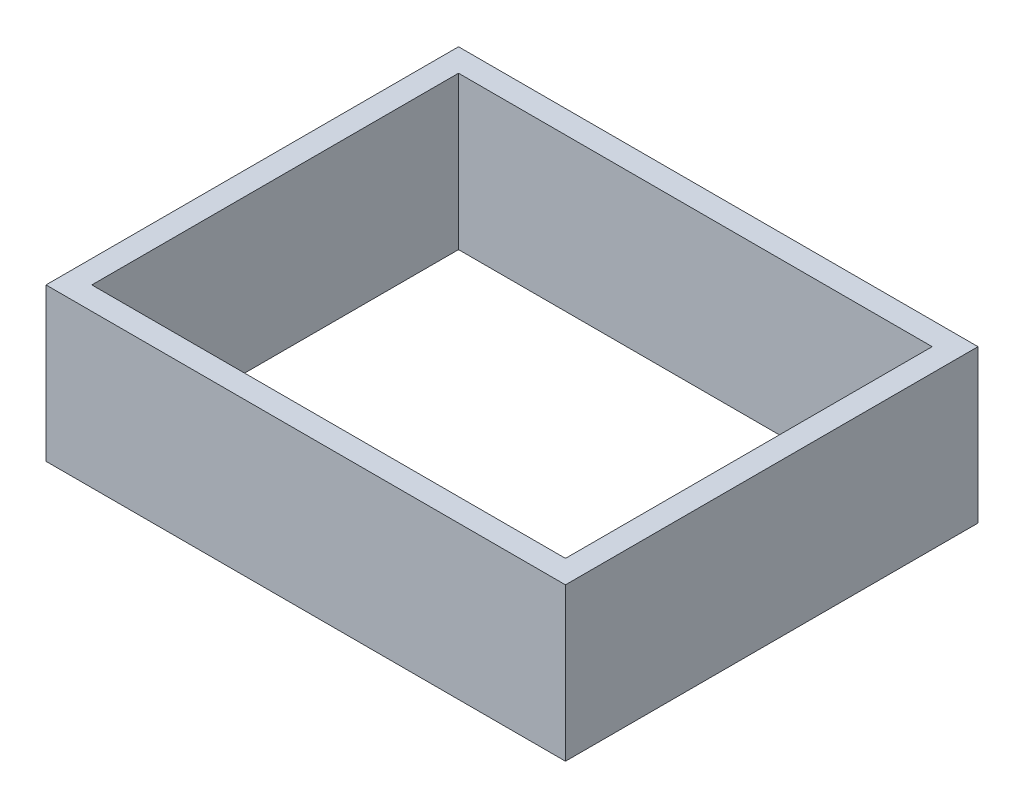
ISO-10303-21;
HEADER;
FILE_DESCRIPTION(('STEP AP214'),'2;1');
FILE_NAME('part.step','',(''),(''),'','','');
FILE_SCHEMA(('AUTOMOTIVE_DESIGN { 1 0 10303 214 1 1 1 1 }'));
ENDSEC;
DATA;
#1=APPLICATION_CONTEXT('core data for automotive mechanical design processes');
#2=APPLICATION_PROTOCOL_DEFINITION('international standard','automotive_design',2000,#1);
#3=PRODUCT_CONTEXT('',#1,'mechanical');
#4=PRODUCT('Part','Part','',(#3));
#5=PRODUCT_RELATED_PRODUCT_CATEGORY('part','',(#4));
#6=PRODUCT_DEFINITION_FORMATION('','',#4);
#7=PRODUCT_DEFINITION_CONTEXT('part definition',#1,'design');
#8=PRODUCT_DEFINITION('design','',#6,#7);
#9=PRODUCT_DEFINITION_SHAPE('','',#8);
#10=(LENGTH_UNIT() NAMED_UNIT(*) SI_UNIT(.MILLI.,.METRE.));
#11=(NAMED_UNIT(*) PLANE_ANGLE_UNIT() SI_UNIT($,.RADIAN.));
#12=(NAMED_UNIT(*) SI_UNIT($,.STERADIAN.) SOLID_ANGLE_UNIT());
#13=UNCERTAINTY_MEASURE_WITH_UNIT(LENGTH_MEASURE(1.E-05),#10,'distance_accuracy_value','');
#14=(GEOMETRIC_REPRESENTATION_CONTEXT(3) GLOBAL_UNCERTAINTY_ASSIGNED_CONTEXT((#13)) GLOBAL_UNIT_ASSIGNED_CONTEXT((#10,
#11,#12)) REPRESENTATION_CONTEXT('',''));
#15=CARTESIAN_POINT('',(0.,0.,0.));
#16=DIRECTION('',(0.,0.,1.));
#17=DIRECTION('',(1.,0.,0.));
#18=AXIS2_PLACEMENT_3D('',#15,#16,#17);
#19=CARTESIAN_POINT('',(0.,20.,0.));
#20=DIRECTION('',(0.,1.,0.));
#21=DIRECTION('',(0.,0.,1.));
#22=AXIS2_PLACEMENT_3D('',#19,#20,#21);
#23=PLANE('',#22);
#24=DIRECTION('',(0.,0.,1.));
#25=VECTOR('',#24,1.);
#26=CARTESIAN_POINT('',(-34.,20.,27.));
#27=LINE('',#26,#25);
#28=CARTESIAN_POINT('',(-34.,20.,-27.));
#29=VERTEX_POINT('',#28);
#30=CARTESIAN_POINT('',(-34.,20.,27.));
#31=VERTEX_POINT('',#30);
#32=EDGE_CURVE('E136',#29,#31,#27,.T.);
#33=ORIENTED_EDGE('',*,*,#32,.T.);
#34=DIRECTION('',(1.,0.,0.));
#35=VECTOR('',#34,1.);
#36=CARTESIAN_POINT('',(34.,20.,27.));
#37=LINE('',#36,#35);
#38=CARTESIAN_POINT('',(34.,20.,27.));
#39=VERTEX_POINT('',#38);
#40=EDGE_CURVE('E139',#31,#39,#37,.T.);
#41=ORIENTED_EDGE('',*,*,#40,.T.);
#42=DIRECTION('',(0.,0.,-1.));
#43=VECTOR('',#42,1.);
#44=CARTESIAN_POINT('',(34.,20.,27.));
#45=LINE('',#44,#43);
#46=CARTESIAN_POINT('',(34.,20.,-27.));
#47=VERTEX_POINT('',#46);
#48=EDGE_CURVE('E142',#39,#47,#45,.T.);
#49=ORIENTED_EDGE('',*,*,#48,.T.);
#50=DIRECTION('',(-1.,0.,0.));
#51=VECTOR('',#50,1.);
#52=CARTESIAN_POINT('',(34.,20.,-27.));
#53=LINE('',#52,#51);
#54=EDGE_CURVE('E144',#47,#29,#53,.T.);
#55=ORIENTED_EDGE('',*,*,#54,.T.);
#56=EDGE_LOOP('',(#33,#41,#49,#55));
#57=FACE_BOUND('',#56,.T.);
#58=DIRECTION('',(-1.,0.,0.));
#59=VECTOR('',#58,1.);
#60=CARTESIAN_POINT('',(31.,20.,-24.));
#61=LINE('',#60,#59);
#62=CARTESIAN_POINT('',(31.,20.,-24.));
#63=VERTEX_POINT('',#62);
#64=CARTESIAN_POINT('',(-31.,20.,-24.));
#65=VERTEX_POINT('',#64);
#66=EDGE_CURVE('E108',#63,#65,#61,.T.);
#67=ORIENTED_EDGE('',*,*,#66,.F.);
#68=DIRECTION('',(0.,0.,-1.));
#69=VECTOR('',#68,1.);
#70=CARTESIAN_POINT('',(31.,20.,24.));
#71=LINE('',#70,#69);
#72=CARTESIAN_POINT('',(31.,20.,24.));
#73=VERTEX_POINT('',#72);
#74=EDGE_CURVE('E100',#73,#63,#71,.T.);
#75=ORIENTED_EDGE('',*,*,#74,.F.);
#76=DIRECTION('',(1.,0.,0.));
#77=VECTOR('',#76,1.);
#78=CARTESIAN_POINT('',(31.,20.,24.));
#79=LINE('',#78,#77);
#80=CARTESIAN_POINT('',(-31.,20.,24.));
#81=VERTEX_POINT('',#80);
#82=EDGE_CURVE('E122',#81,#73,#79,.T.);
#83=ORIENTED_EDGE('',*,*,#82,.F.);
#84=DIRECTION('',(0.,0.,1.));
#85=VECTOR('',#84,1.);
#86=CARTESIAN_POINT('',(-31.,20.,24.));
#87=LINE('',#86,#85);
#88=EDGE_CURVE('E120',#65,#81,#87,.T.);
#89=ORIENTED_EDGE('',*,*,#88,.F.);
#90=EDGE_LOOP('',(#67,#75,#83,#89));
#91=FACE_BOUND('',#90,.T.);
#92=ADVANCED_FACE('F35',(#57,#91),#23,.T.);
#93=CARTESIAN_POINT('',(0.,0.,0.));
#94=DIRECTION('',(0.,1.,0.));
#95=DIRECTION('',(0.,0.,1.));
#96=AXIS2_PLACEMENT_3D('',#93,#94,#95);
#97=PLANE('',#96);
#98=DIRECTION('',(0.,0.,1.));
#99=VECTOR('',#98,1.);
#100=CARTESIAN_POINT('',(-34.,0.,27.));
#101=LINE('',#100,#99);
#102=CARTESIAN_POINT('',(-34.,0.,-27.));
#103=VERTEX_POINT('',#102);
#104=CARTESIAN_POINT('',(-34.,0.,27.));
#105=VERTEX_POINT('',#104);
#106=EDGE_CURVE('E116',#103,#105,#101,.T.);
#107=ORIENTED_EDGE('',*,*,#106,.F.);
#108=DIRECTION('',(-1.,0.,0.));
#109=VECTOR('',#108,1.);
#110=CARTESIAN_POINT('',(34.,0.,-27.));
#111=LINE('',#110,#109);
#112=CARTESIAN_POINT('',(34.,0.,-27.));
#113=VERTEX_POINT('',#112);
#114=EDGE_CURVE('E140',#113,#103,#111,.T.);
#115=ORIENTED_EDGE('',*,*,#114,.F.);
#116=DIRECTION('',(0.,0.,-1.));
#117=VECTOR('',#116,1.);
#118=CARTESIAN_POINT('',(34.,0.,27.));
#119=LINE('',#118,#117);
#120=CARTESIAN_POINT('',(34.,0.,27.));
#121=VERTEX_POINT('',#120);
#122=EDGE_CURVE('E151',#121,#113,#119,.T.);
#123=ORIENTED_EDGE('',*,*,#122,.F.);
#124=DIRECTION('',(1.,0.,0.));
#125=VECTOR('',#124,1.);
#126=CARTESIAN_POINT('',(34.,0.,27.));
#127=LINE('',#126,#125);
#128=EDGE_CURVE('E149',#105,#121,#127,.T.);
#129=ORIENTED_EDGE('',*,*,#128,.F.);
#130=EDGE_LOOP('',(#107,#115,#123,#129));
#131=FACE_BOUND('',#130,.T.);
#132=DIRECTION('',(0.,0.,-1.));
#133=VECTOR('',#132,1.);
#134=CARTESIAN_POINT('',(31.,0.,24.));
#135=LINE('',#134,#133);
#136=CARTESIAN_POINT('',(31.,0.,24.));
#137=VERTEX_POINT('',#136);
#138=CARTESIAN_POINT('',(31.,0.,-24.));
#139=VERTEX_POINT('',#138);
#140=EDGE_CURVE('E58',#137,#139,#135,.T.);
#141=ORIENTED_EDGE('',*,*,#140,.T.);
#142=DIRECTION('',(-1.,0.,0.));
#143=VECTOR('',#142,1.);
#144=CARTESIAN_POINT('',(31.,0.,-24.));
#145=LINE('',#144,#143);
#146=CARTESIAN_POINT('',(-31.,0.,-24.));
#147=VERTEX_POINT('',#146);
#148=EDGE_CURVE('E115',#139,#147,#145,.T.);
#149=ORIENTED_EDGE('',*,*,#148,.T.);
#150=DIRECTION('',(0.,0.,1.));
#151=VECTOR('',#150,1.);
#152=CARTESIAN_POINT('',(-31.,0.,24.));
#153=LINE('',#152,#151);
#154=CARTESIAN_POINT('',(-31.,0.,24.));
#155=VERTEX_POINT('',#154);
#156=EDGE_CURVE('E128',#147,#155,#153,.T.);
#157=ORIENTED_EDGE('',*,*,#156,.T.);
#158=DIRECTION('',(1.,0.,0.));
#159=VECTOR('',#158,1.);
#160=CARTESIAN_POINT('',(31.,0.,24.));
#161=LINE('',#160,#159);
#162=EDGE_CURVE('E109',#155,#137,#161,.T.);
#163=ORIENTED_EDGE('',*,*,#162,.T.);
#164=EDGE_LOOP('',(#141,#149,#157,#163));
#165=FACE_BOUND('',#164,.T.);
#166=ADVANCED_FACE('F169',(#131,#165),#97,.F.);
#167=CARTESIAN_POINT('',(-34.,20.,27.));
#168=DIRECTION('',(1.,0.,0.));
#169=DIRECTION('',(0.,0.,-1.));
#170=AXIS2_PLACEMENT_3D('',#167,#168,#169);
#171=PLANE('',#170);
#172=ORIENTED_EDGE('',*,*,#106,.T.);
#173=DIRECTION('',(0.,-1.,0.));
#174=VECTOR('',#173,1.);
#175=CARTESIAN_POINT('',(-34.,20.,27.));
#176=LINE('',#175,#174);
#177=EDGE_CURVE('E11',#31,#105,#176,.T.);
#178=ORIENTED_EDGE('',*,*,#177,.F.);
#179=ORIENTED_EDGE('',*,*,#32,.F.);
#180=DIRECTION('',(0.,-1.,0.));
#181=VECTOR('',#180,1.);
#182=CARTESIAN_POINT('',(-34.,20.,-27.));
#183=LINE('',#182,#181);
#184=EDGE_CURVE('E146',#29,#103,#183,.T.);
#185=ORIENTED_EDGE('',*,*,#184,.T.);
#186=EDGE_LOOP('',(#172,#178,#179,#185));
#187=FACE_BOUND('',#186,.T.);
#188=ADVANCED_FACE('F37',(#187),#171,.F.);
#189=CARTESIAN_POINT('',(34.,20.,27.));
#190=DIRECTION('',(0.,0.,-1.));
#191=DIRECTION('',(-1.,0.,0.));
#192=AXIS2_PLACEMENT_3D('',#189,#190,#191);
#193=PLANE('',#192);
#194=ORIENTED_EDGE('',*,*,#128,.T.);
#195=DIRECTION('',(0.,-1.,0.));
#196=VECTOR('',#195,1.);
#197=CARTESIAN_POINT('',(34.,20.,27.));
#198=LINE('',#197,#196);
#199=EDGE_CURVE('E43',#39,#121,#198,.T.);
#200=ORIENTED_EDGE('',*,*,#199,.F.);
#201=ORIENTED_EDGE('',*,*,#40,.F.);
#202=ORIENTED_EDGE('',*,*,#177,.T.);
#203=EDGE_LOOP('',(#194,#200,#201,#202));
#204=FACE_BOUND('',#203,.T.);
#205=ADVANCED_FACE('F179',(#204),#193,.F.);
#206=CARTESIAN_POINT('',(34.,20.,27.));
#207=DIRECTION('',(-1.,0.,0.));
#208=DIRECTION('',(0.,0.,1.));
#209=AXIS2_PLACEMENT_3D('',#206,#207,#208);
#210=PLANE('',#209);
#211=ORIENTED_EDGE('',*,*,#122,.T.);
#212=DIRECTION('',(0.,-1.,0.));
#213=VECTOR('',#212,1.);
#214=CARTESIAN_POINT('',(34.,20.,-27.));
#215=LINE('',#214,#213);
#216=EDGE_CURVE('E156',#47,#113,#215,.T.);
#217=ORIENTED_EDGE('',*,*,#216,.F.);
#218=ORIENTED_EDGE('',*,*,#48,.F.);
#219=ORIENTED_EDGE('',*,*,#199,.T.);
#220=EDGE_LOOP('',(#211,#217,#218,#219));
#221=FACE_BOUND('',#220,.T.);
#222=ADVANCED_FACE('F163',(#221),#210,.F.);
#223=CARTESIAN_POINT('',(34.,20.,-27.));
#224=DIRECTION('',(0.,0.,1.));
#225=DIRECTION('',(1.,0.,0.));
#226=AXIS2_PLACEMENT_3D('',#223,#224,#225);
#227=PLANE('',#226);
#228=ORIENTED_EDGE('',*,*,#114,.T.);
#229=ORIENTED_EDGE('',*,*,#184,.F.);
#230=ORIENTED_EDGE('',*,*,#54,.F.);
#231=ORIENTED_EDGE('',*,*,#216,.T.);
#232=EDGE_LOOP('',(#228,#229,#230,#231));
#233=FACE_BOUND('',#232,.T.);
#234=ADVANCED_FACE('F173',(#233),#227,.F.);
#235=CARTESIAN_POINT('',(31.,20.,24.));
#236=DIRECTION('',(-1.,0.,0.));
#237=DIRECTION('',(0.,0.,1.));
#238=AXIS2_PLACEMENT_3D('',#235,#236,#237);
#239=PLANE('',#238);
#240=ORIENTED_EDGE('',*,*,#140,.F.);
#241=DIRECTION('',(0.,-1.,0.));
#242=VECTOR('',#241,1.);
#243=CARTESIAN_POINT('',(31.,20.,24.));
#244=LINE('',#243,#242);
#245=EDGE_CURVE('E104',#73,#137,#244,.T.);
#246=ORIENTED_EDGE('',*,*,#245,.F.);
#247=ORIENTED_EDGE('',*,*,#74,.T.);
#248=DIRECTION('',(0.,-1.,0.));
#249=VECTOR('',#248,1.);
#250=CARTESIAN_POINT('',(31.,20.,-24.));
#251=LINE('',#250,#249);
#252=EDGE_CURVE('E103',#63,#139,#251,.T.);
#253=ORIENTED_EDGE('',*,*,#252,.T.);
#254=EDGE_LOOP('',(#240,#246,#247,#253));
#255=FACE_BOUND('',#254,.T.);
#256=ADVANCED_FACE('F102',(#255),#239,.T.);
#257=CARTESIAN_POINT('',(31.,20.,-24.));
#258=DIRECTION('',(0.,0.,1.));
#259=DIRECTION('',(1.,0.,0.));
#260=AXIS2_PLACEMENT_3D('',#257,#258,#259);
#261=PLANE('',#260);
#262=ORIENTED_EDGE('',*,*,#148,.F.);
#263=ORIENTED_EDGE('',*,*,#252,.F.);
#264=ORIENTED_EDGE('',*,*,#66,.T.);
#265=DIRECTION('',(0.,-1.,0.));
#266=VECTOR('',#265,1.);
#267=CARTESIAN_POINT('',(-31.,20.,-24.));
#268=LINE('',#267,#266);
#269=EDGE_CURVE('E117',#65,#147,#268,.T.);
#270=ORIENTED_EDGE('',*,*,#269,.T.);
#271=EDGE_LOOP('',(#262,#263,#264,#270));
#272=FACE_BOUND('',#271,.T.);
#273=ADVANCED_FACE('F112',(#272),#261,.T.);
#274=CARTESIAN_POINT('',(-31.,20.,24.));
#275=DIRECTION('',(1.,0.,0.));
#276=DIRECTION('',(0.,0.,-1.));
#277=AXIS2_PLACEMENT_3D('',#274,#275,#276);
#278=PLANE('',#277);
#279=ORIENTED_EDGE('',*,*,#156,.F.);
#280=ORIENTED_EDGE('',*,*,#269,.F.);
#281=ORIENTED_EDGE('',*,*,#88,.T.);
#282=DIRECTION('',(0.,-1.,0.));
#283=VECTOR('',#282,1.);
#284=CARTESIAN_POINT('',(-31.,20.,24.));
#285=LINE('',#284,#283);
#286=EDGE_CURVE('E50',#81,#155,#285,.T.);
#287=ORIENTED_EDGE('',*,*,#286,.T.);
#288=EDGE_LOOP('',(#279,#280,#281,#287));
#289=FACE_BOUND('',#288,.T.);
#290=ADVANCED_FACE('F202',(#289),#278,.T.);
#291=CARTESIAN_POINT('',(31.,20.,24.));
#292=DIRECTION('',(0.,0.,-1.));
#293=DIRECTION('',(-1.,0.,0.));
#294=AXIS2_PLACEMENT_3D('',#291,#292,#293);
#295=PLANE('',#294);
#296=ORIENTED_EDGE('',*,*,#162,.F.);
#297=ORIENTED_EDGE('',*,*,#286,.F.);
#298=ORIENTED_EDGE('',*,*,#82,.T.);
#299=ORIENTED_EDGE('',*,*,#245,.T.);
#300=EDGE_LOOP('',(#296,#297,#298,#299));
#301=FACE_BOUND('',#300,.T.);
#302=ADVANCED_FACE('F206',(#301),#295,.T.);
#303=CLOSED_SHELL('',(#92,#166,#188,#205,#222,#234,#256,#273,#290,#302));
#304=MANIFOLD_SOLID_BREP('B2',#303);
#305=ADVANCED_BREP_SHAPE_REPRESENTATION('',(#18,#304),#14);
#306=SHAPE_DEFINITION_REPRESENTATION(#9,#305);
ENDSEC;
END-ISO-10303-21;
